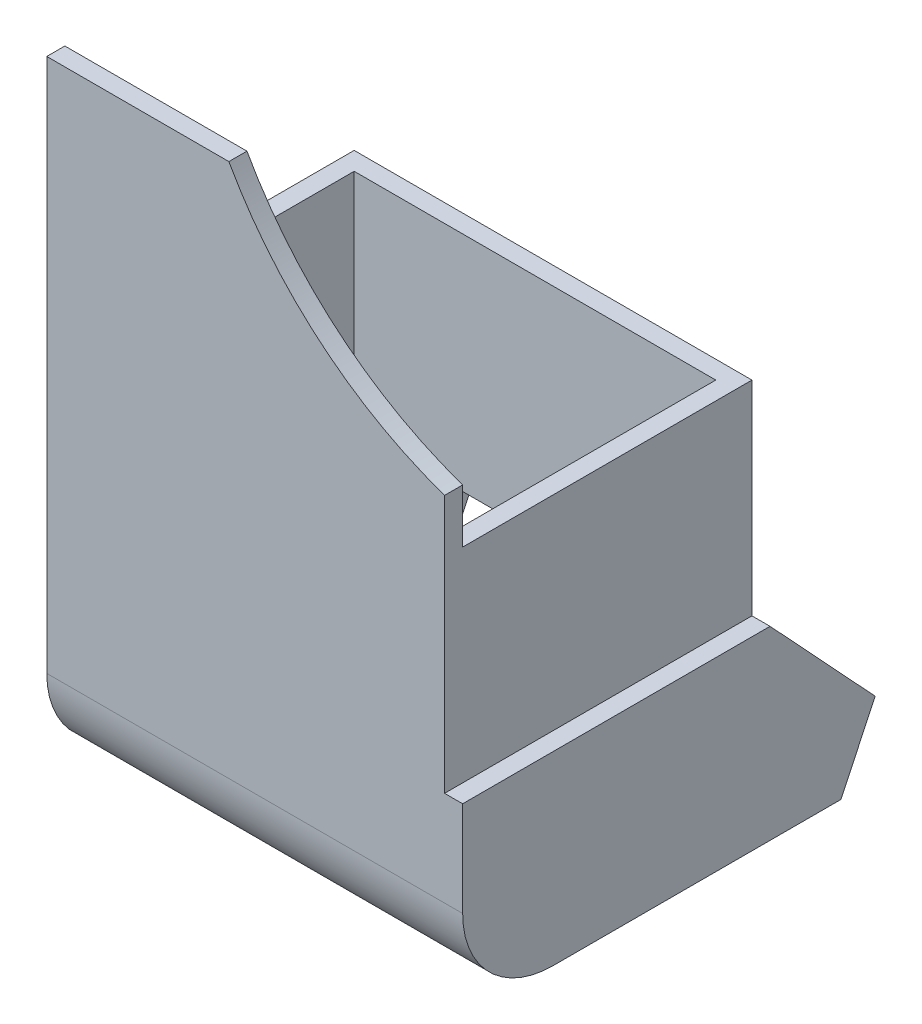
ISO-10303-21;
HEADER;
FILE_DESCRIPTION(('STEP AP214'),'2;1');
FILE_NAME('part.step','',(''),(''),'','','');
FILE_SCHEMA(('AUTOMOTIVE_DESIGN { 1 0 10303 214 1 1 1 1 }'));
ENDSEC;
DATA;
#1=APPLICATION_CONTEXT('core data for automotive mechanical design processes');
#2=APPLICATION_PROTOCOL_DEFINITION('international standard','automotive_design',2000,#1);
#3=PRODUCT_CONTEXT('',#1,'mechanical');
#4=PRODUCT('Part','Part','',(#3));
#5=PRODUCT_RELATED_PRODUCT_CATEGORY('part','',(#4));
#6=PRODUCT_DEFINITION_FORMATION('','',#4);
#7=PRODUCT_DEFINITION_CONTEXT('part definition',#1,'design');
#8=PRODUCT_DEFINITION('design','',#6,#7);
#9=PRODUCT_DEFINITION_SHAPE('','',#8);
#10=(LENGTH_UNIT() NAMED_UNIT(*) SI_UNIT(.MILLI.,.METRE.));
#11=(NAMED_UNIT(*) PLANE_ANGLE_UNIT() SI_UNIT($,.RADIAN.));
#12=(NAMED_UNIT(*) SI_UNIT($,.STERADIAN.) SOLID_ANGLE_UNIT());
#13=UNCERTAINTY_MEASURE_WITH_UNIT(LENGTH_MEASURE(1.E-05),#10,'distance_accuracy_value','');
#14=(GEOMETRIC_REPRESENTATION_CONTEXT(3) GLOBAL_UNCERTAINTY_ASSIGNED_CONTEXT((#13)) GLOBAL_UNIT_ASSIGNED_CONTEXT((#10,
#11,#12)) REPRESENTATION_CONTEXT('',''));
#15=CARTESIAN_POINT('',(0.,0.,0.));
#16=DIRECTION('',(0.,0.,1.));
#17=DIRECTION('',(1.,0.,0.));
#18=AXIS2_PLACEMENT_3D('',#15,#16,#17);
#19=CARTESIAN_POINT('',(0.,34.55,0.));
#20=DIRECTION('',(0.,-1.,0.));
#21=DIRECTION('',(0.,0.,-1.));
#22=AXIS2_PLACEMENT_3D('',#19,#20,#21);
#23=PLANE('',#22);
#24=DIRECTION('',(1.,0.,0.));
#25=VECTOR('',#24,1.);
#26=CARTESIAN_POINT('',(0.,34.55,0.));
#27=LINE('',#26,#25);
#28=CARTESIAN_POINT('',(0.,34.55,0.));
#29=VERTEX_POINT('',#28);
#30=CARTESIAN_POINT('',(10.0701247517087,34.55,0.));
#31=VERTEX_POINT('',#30);
#32=EDGE_CURVE('E207',#29,#31,#27,.T.);
#33=ORIENTED_EDGE('',*,*,#32,.T.);
#34=DIRECTION('',(0.,0.,1.));
#35=VECTOR('',#34,1.);
#36=CARTESIAN_POINT('',(10.0701247517087,34.55,-26.294));
#37=LINE('',#36,#35);
#38=CARTESIAN_POINT('',(10.0701247517087,34.55,-1.));
#39=VERTEX_POINT('',#38);
#40=EDGE_CURVE('E190',#39,#31,#37,.T.);
#41=ORIENTED_EDGE('',*,*,#40,.F.);
#42=DIRECTION('',(1.,0.,0.));
#43=VECTOR('',#42,1.);
#44=CARTESIAN_POINT('',(0.,34.55,-1.));
#45=LINE('',#44,#43);
#46=CARTESIAN_POINT('',(0.,34.55,-1.));
#47=VERTEX_POINT('',#46);
#48=EDGE_CURVE('E463',#47,#39,#45,.T.);
#49=ORIENTED_EDGE('',*,*,#48,.F.);
#50=DIRECTION('',(0.,0.,1.));
#51=VECTOR('',#50,1.);
#52=CARTESIAN_POINT('',(0.,34.55,0.));
#53=LINE('',#52,#51);
#54=EDGE_CURVE('E212',#47,#29,#53,.T.);
#55=ORIENTED_EDGE('',*,*,#54,.T.);
#56=EDGE_LOOP('',(#33,#41,#49,#55));
#57=FACE_BOUND('',#56,.T.);
#58=ADVANCED_FACE('F33',(#57),#23,.F.);
#59=CARTESIAN_POINT('',(0.,10.256,0.));
#60=DIRECTION('',(0.,-1.,0.));
#61=DIRECTION('',(0.,0.,-1.));
#62=AXIS2_PLACEMENT_3D('',#59,#60,#61);
#63=PLANE('',#62);
#64=DIRECTION('',(0.,0.,-1.));
#65=VECTOR('',#64,1.);
#66=CARTESIAN_POINT('',(22.,10.256,0.));
#67=LINE('',#66,#65);
#68=CARTESIAN_POINT('',(22.,10.256,0.));
#69=VERTEX_POINT('',#68);
#70=CARTESIAN_POINT('',(22.,10.256,-17.));
#71=VERTEX_POINT('',#70);
#72=EDGE_CURVE('E222',#69,#71,#67,.T.);
#73=ORIENTED_EDGE('',*,*,#72,.F.);
#74=DIRECTION('',(1.,0.,0.));
#75=VECTOR('',#74,1.);
#76=CARTESIAN_POINT('',(0.,10.256,0.));
#77=LINE('',#76,#75);
#78=CARTESIAN_POINT('',(23.,10.256,0.));
#79=VERTEX_POINT('',#78);
#80=EDGE_CURVE('E283',#69,#79,#77,.T.);
#81=ORIENTED_EDGE('',*,*,#80,.T.);
#82=DIRECTION('',(0.,0.,-1.));
#83=VECTOR('',#82,1.);
#84=CARTESIAN_POINT('',(23.,10.256,0.));
#85=LINE('',#84,#83);
#86=CARTESIAN_POINT('',(23.,10.256,-17.));
#87=VERTEX_POINT('',#86);
#88=EDGE_CURVE('E285',#79,#87,#85,.T.);
#89=ORIENTED_EDGE('',*,*,#88,.T.);
#90=DIRECTION('',(-1.,0.,0.));
#91=VECTOR('',#90,1.);
#92=CARTESIAN_POINT('',(0.,10.256,-17.));
#93=LINE('',#92,#91);
#94=EDGE_CURVE('E288',#87,#71,#93,.T.);
#95=ORIENTED_EDGE('',*,*,#94,.T.);
#96=EDGE_LOOP('',(#73,#81,#89,#95));
#97=FACE_BOUND('',#96,.T.);
#98=ADVANCED_FACE('F345',(#97),#63,.F.);
#99=CARTESIAN_POINT('',(0.,0.,-20.918));
#100=DIRECTION('',(0.,-0.42877746511979,-0.903410142407892));
#101=DIRECTION('',(0.,0.903410142407892,-0.42877746511979));
#102=AXIS2_PLACEMENT_3D('',#99,#100,#101);
#103=PLANE('',#102);
#104=DIRECTION('',(0.,0.903410142407892,-0.42877746511979));
#105=VECTOR('',#104,1.);
#106=CARTESIAN_POINT('',(23.,0.,-20.918));
#107=LINE('',#106,#105);
#108=CARTESIAN_POINT('',(23.,0.,-20.918));
#109=VERTEX_POINT('',#108);
#110=CARTESIAN_POINT('',(23.,4.00030011058215,-22.8166266155504));
#111=VERTEX_POINT('',#110);
#112=EDGE_CURVE('E238',#109,#111,#107,.T.);
#113=ORIENTED_EDGE('',*,*,#112,.F.);
#114=DIRECTION('',(1.,0.,0.));
#115=VECTOR('',#114,1.);
#116=CARTESIAN_POINT('',(0.,0.,-20.918));
#117=LINE('',#116,#115);
#118=CARTESIAN_POINT('',(0.,0.,-20.918));
#119=VERTEX_POINT('',#118);
#120=EDGE_CURVE('E273',#119,#109,#117,.T.);
#121=ORIENTED_EDGE('',*,*,#120,.F.);
#122=DIRECTION('',(0.,0.903410142407892,-0.42877746511979));
#123=VECTOR('',#122,1.);
#124=CARTESIAN_POINT('',(0.,0.,-20.918));
#125=LINE('',#124,#123);
#126=CARTESIAN_POINT('',(0.,4.00030011058215,-22.8166266155504));
#127=VERTEX_POINT('',#126);
#128=EDGE_CURVE('E266',#119,#127,#125,.T.);
#129=ORIENTED_EDGE('',*,*,#128,.T.);
#130=DIRECTION('',(1.,0.,0.));
#131=VECTOR('',#130,1.);
#132=CARTESIAN_POINT('',(0.,4.00030011058215,-22.8166266155504));
#133=LINE('',#132,#131);
#134=EDGE_CURVE('E278',#127,#111,#133,.T.);
#135=ORIENTED_EDGE('',*,*,#134,.T.);
#136=EDGE_LOOP('',(#113,#121,#129,#135));
#137=FACE_BOUND('',#136,.T.);
#138=DIRECTION('',(1.,0.,0.));
#139=VECTOR('',#138,1.);
#140=CARTESIAN_POINT('',(0.,1.044,-21.4135043701324));
#141=LINE('',#140,#139);
#142=CARTESIAN_POINT('',(1.044,1.044,-21.4135043701324));
#143=VERTEX_POINT('',#142);
#144=CARTESIAN_POINT('',(21.956,1.044,-21.4135043701324));
#145=VERTEX_POINT('',#144);
#146=EDGE_CURVE('E247',#143,#145,#141,.T.);
#147=ORIENTED_EDGE('',*,*,#146,.T.);
#148=DIRECTION('',(0.,0.903410142407892,-0.42877746511979));
#149=VECTOR('',#148,1.);
#150=CARTESIAN_POINT('',(21.956,0.,-20.918));
#151=LINE('',#150,#149);
#152=CARTESIAN_POINT('',(21.956,2.9852523174822,-22.3348635720885));
#153=VERTEX_POINT('',#152);
#154=EDGE_CURVE('E230',#145,#153,#151,.T.);
#155=ORIENTED_EDGE('',*,*,#154,.T.);
#156=DIRECTION('',(1.,0.,0.));
#157=VECTOR('',#156,1.);
#158=CARTESIAN_POINT('',(0.,2.9852523174822,-22.3348635720885));
#159=LINE('',#158,#157);
#160=CARTESIAN_POINT('',(1.044,2.9852523174822,-22.3348635720885));
#161=VERTEX_POINT('',#160);
#162=EDGE_CURVE('E235',#161,#153,#159,.T.);
#163=ORIENTED_EDGE('',*,*,#162,.F.);
#164=DIRECTION('',(0.,0.903410142407892,-0.42877746511979));
#165=VECTOR('',#164,1.);
#166=CARTESIAN_POINT('',(1.044,0.267596774077476,-21.045007060334));
#167=LINE('',#166,#165);
#168=EDGE_CURVE('E248',#143,#161,#167,.T.);
#169=ORIENTED_EDGE('',*,*,#168,.F.);
#170=EDGE_LOOP('',(#147,#155,#163,#169));
#171=FACE_BOUND('',#170,.T.);
#172=ADVANCED_FACE('F334',(#137,#171),#103,.T.);
#173=CARTESIAN_POINT('',(0.,10.256,0.));
#174=DIRECTION('',(1.,0.,0.));
#175=DIRECTION('',(0.,0.,-1.));
#176=AXIS2_PLACEMENT_3D('',#173,#174,#175);
#177=PLANE('',#176);
#178=DIRECTION('',(0.,0.,1.));
#179=VECTOR('',#178,1.);
#180=CARTESIAN_POINT('',(0.,0.,0.));
#181=LINE('',#180,#179);
#182=CARTESIAN_POINT('',(0.,0.,-5.));
#183=VERTEX_POINT('',#182);
#184=EDGE_CURVE('E280',#119,#183,#181,.T.);
#185=ORIENTED_EDGE('',*,*,#184,.T.);
#186=CARTESIAN_POINT('',(0.,5.,-5.));
#187=DIRECTION('',(1.,0.,0.));
#188=DIRECTION('',(0.,0.,-1.));
#189=AXIS2_PLACEMENT_3D('',#186,#187,#188);
#190=CIRCLE('',#189,5.);
#191=CARTESIAN_POINT('',(0.,5.,0.));
#192=VERTEX_POINT('',#191);
#193=EDGE_CURVE('E317',#183,#192,#190,.F.);
#194=ORIENTED_EDGE('',*,*,#193,.T.);
#195=DIRECTION('',(0.,-1.,0.));
#196=VECTOR('',#195,1.);
#197=CARTESIAN_POINT('',(0.,10.256,0.));
#198=LINE('',#197,#196);
#199=EDGE_CURVE('E297',#29,#192,#198,.T.);
#200=ORIENTED_EDGE('',*,*,#199,.F.);
#201=ORIENTED_EDGE('',*,*,#54,.F.);
#202=DIRECTION('',(0.,-1.,0.));
#203=VECTOR('',#202,1.);
#204=CARTESIAN_POINT('',(0.,10.256,-1.));
#205=LINE('',#204,#203);
#206=CARTESIAN_POINT('',(0.,21.55,-1.));
#207=VERTEX_POINT('',#206);
#208=EDGE_CURVE('E442',#47,#207,#205,.T.);
#209=ORIENTED_EDGE('',*,*,#208,.T.);
#210=DIRECTION('',(0.,0.,-1.));
#211=VECTOR('',#210,1.);
#212=CARTESIAN_POINT('',(0.,21.55,0.));
#213=LINE('',#212,#211);
#214=CARTESIAN_POINT('',(0.,21.55,-17.));
#215=VERTEX_POINT('',#214);
#216=EDGE_CURVE('E439',#207,#215,#213,.T.);
#217=ORIENTED_EDGE('',*,*,#216,.T.);
#218=DIRECTION('',(0.,-1.,0.));
#219=VECTOR('',#218,1.);
#220=CARTESIAN_POINT('',(0.,34.55,-17.));
#221=LINE('',#220,#219);
#222=CARTESIAN_POINT('',(0.,10.256,-17.));
#223=VERTEX_POINT('',#222);
#224=EDGE_CURVE('E214',#215,#223,#221,.T.);
#225=ORIENTED_EDGE('',*,*,#224,.T.);
#226=DIRECTION('',(0.,0.732340209043995,0.680938923999354));
#227=VECTOR('',#226,1.);
#228=CARTESIAN_POINT('',(0.,4.00030011058215,-22.8166266155504));
#229=LINE('',#228,#227);
#230=EDGE_CURVE('E269',#127,#223,#229,.T.);
#231=ORIENTED_EDGE('',*,*,#230,.F.);
#232=ORIENTED_EDGE('',*,*,#128,.F.);
#233=EDGE_LOOP('',(#185,#194,#200,#201,#209,#217,#225,#231,#232));
#234=FACE_BOUND('',#233,.T.);
#235=ADVANCED_FACE('F388',(#234),#177,.F.);
#236=CARTESIAN_POINT('',(0.,10.256,0.));
#237=DIRECTION('',(0.,0.,-1.));
#238=DIRECTION('',(-1.,0.,0.));
#239=AXIS2_PLACEMENT_3D('',#236,#237,#238);
#240=PLANE('',#239);
#241=ORIENTED_EDGE('',*,*,#199,.T.);
#242=DIRECTION('',(1.,0.,0.));
#243=VECTOR('',#242,1.);
#244=CARTESIAN_POINT('',(23.,5.,0.));
#245=LINE('',#244,#243);
#246=CARTESIAN_POINT('',(23.,5.,0.));
#247=VERTEX_POINT('',#246);
#248=EDGE_CURVE('E310',#192,#247,#245,.T.);
#249=ORIENTED_EDGE('',*,*,#248,.T.);
#250=DIRECTION('',(0.,-1.,0.));
#251=VECTOR('',#250,1.);
#252=CARTESIAN_POINT('',(23.,10.256,0.));
#253=LINE('',#252,#251);
#254=EDGE_CURVE('E291',#79,#247,#253,.T.);
#255=ORIENTED_EDGE('',*,*,#254,.F.);
#256=ORIENTED_EDGE('',*,*,#80,.F.);
#257=DIRECTION('',(0.,-1.,0.));
#258=VECTOR('',#257,1.);
#259=CARTESIAN_POINT('',(22.,34.55,0.));
#260=LINE('',#259,#258);
#261=CARTESIAN_POINT('',(22.,24.5273191003027,0.));
#262=VERTEX_POINT('',#261);
#263=EDGE_CURVE('E209',#262,#69,#260,.T.);
#264=ORIENTED_EDGE('',*,*,#263,.F.);
#265=CARTESIAN_POINT('',(29.1848877777159,45.1907368886367,0.));
#266=DIRECTION('',(0.,0.,1.));
#267=DIRECTION('',(1.,0.,0.));
#268=AXIS2_PLACEMENT_3D('',#265,#266,#267);
#269=CIRCLE('',#268,21.8769158492144);
#270=EDGE_CURVE('E193',#31,#262,#269,.T.);
#271=ORIENTED_EDGE('',*,*,#270,.F.);
#272=ORIENTED_EDGE('',*,*,#32,.F.);
#273=EDGE_LOOP('',(#241,#249,#255,#256,#264,#271,#272));
#274=FACE_BOUND('',#273,.T.);
#275=ADVANCED_FACE('F206',(#274),#240,.F.);
#276=CARTESIAN_POINT('',(23.,10.256,0.));
#277=DIRECTION('',(-1.,0.,0.));
#278=DIRECTION('',(0.,0.,1.));
#279=AXIS2_PLACEMENT_3D('',#276,#277,#278);
#280=PLANE('',#279);
#281=ORIENTED_EDGE('',*,*,#254,.T.);
#282=CARTESIAN_POINT('',(23.,5.,-5.));
#283=DIRECTION('',(-1.,0.,0.));
#284=DIRECTION('',(0.,0.,1.));
#285=AXIS2_PLACEMENT_3D('',#282,#283,#284);
#286=CIRCLE('',#285,5.);
#287=CARTESIAN_POINT('',(23.,0.,-5.));
#288=VERTEX_POINT('',#287);
#289=EDGE_CURVE('E313',#247,#288,#286,.F.);
#290=ORIENTED_EDGE('',*,*,#289,.T.);
#291=DIRECTION('',(0.,0.,-1.));
#292=VECTOR('',#291,1.);
#293=CARTESIAN_POINT('',(23.,0.,0.));
#294=LINE('',#293,#292);
#295=EDGE_CURVE('E286',#288,#109,#294,.T.);
#296=ORIENTED_EDGE('',*,*,#295,.T.);
#297=ORIENTED_EDGE('',*,*,#112,.T.);
#298=DIRECTION('',(0.,0.732340209043995,0.680938923999354));
#299=VECTOR('',#298,1.);
#300=CARTESIAN_POINT('',(23.,4.00030011058215,-22.8166266155504));
#301=LINE('',#300,#299);
#302=EDGE_CURVE('E270',#111,#87,#301,.T.);
#303=ORIENTED_EDGE('',*,*,#302,.T.);
#304=ORIENTED_EDGE('',*,*,#88,.F.);
#305=EDGE_LOOP('',(#281,#290,#296,#297,#303,#304));
#306=FACE_BOUND('',#305,.T.);
#307=ADVANCED_FACE('F393',(#306),#280,.F.);
#308=CARTESIAN_POINT('',(0.,0.,0.));
#309=DIRECTION('',(0.,-1.,0.));
#310=DIRECTION('',(0.,0.,-1.));
#311=AXIS2_PLACEMENT_3D('',#308,#309,#310);
#312=PLANE('',#311);
#313=ORIENTED_EDGE('',*,*,#295,.F.);
#314=DIRECTION('',(1.,0.,0.));
#315=VECTOR('',#314,1.);
#316=CARTESIAN_POINT('',(0.,0.,-5.));
#317=LINE('',#316,#315);
#318=EDGE_CURVE('E315',#288,#183,#317,.F.);
#319=ORIENTED_EDGE('',*,*,#318,.T.);
#320=ORIENTED_EDGE('',*,*,#184,.F.);
#321=ORIENTED_EDGE('',*,*,#120,.T.);
#322=EDGE_LOOP('',(#313,#319,#320,#321));
#323=FACE_BOUND('',#322,.T.);
#324=ADVANCED_FACE('F385',(#323),#312,.T.);
#325=CARTESIAN_POINT('',(0.,4.00030011058215,-22.8166266155504));
#326=DIRECTION('',(0.,0.680938923999354,-0.732340209043995));
#327=DIRECTION('',(0.,0.732340209043995,0.680938923999354));
#328=AXIS2_PLACEMENT_3D('',#325,#326,#327);
#329=PLANE('',#328);
#330=ORIENTED_EDGE('',*,*,#302,.F.);
#331=ORIENTED_EDGE('',*,*,#134,.F.);
#332=ORIENTED_EDGE('',*,*,#230,.T.);
#333=DIRECTION('',(-1.,0.,0.));
#334=VECTOR('',#333,1.);
#335=CARTESIAN_POINT('',(0.,10.256,-17.));
#336=LINE('',#335,#334);
#337=EDGE_CURVE('E218',#71,#223,#336,.T.);
#338=ORIENTED_EDGE('',*,*,#337,.F.);
#339=ORIENTED_EDGE('',*,*,#94,.F.);
#340=EDGE_LOOP('',(#330,#331,#332,#338,#339));
#341=FACE_BOUND('',#340,.T.);
#342=ADVANCED_FACE('F369',(#341),#329,.T.);
#343=CARTESIAN_POINT('',(1.044,10.256,0.));
#344=DIRECTION('',(1.,0.,0.));
#345=DIRECTION('',(0.,0.,-1.));
#346=AXIS2_PLACEMENT_3D('',#343,#344,#345);
#347=PLANE('',#346);
#348=DIRECTION('',(0.,-1.,0.));
#349=VECTOR('',#348,1.);
#350=CARTESIAN_POINT('',(1.044,10.256,-1.044));
#351=LINE('',#350,#349);
#352=CARTESIAN_POINT('',(1.044,6.918,-1.044));
#353=VERTEX_POINT('',#352);
#354=CARTESIAN_POINT('',(1.044,6.044,-1.044));
#355=VERTEX_POINT('',#354);
#356=EDGE_CURVE('E236',#353,#355,#351,.T.);
#357=ORIENTED_EDGE('',*,*,#356,.T.);
#358=CARTESIAN_POINT('',(1.044,6.044,-6.044));
#359=DIRECTION('',(1.,0.,0.));
#360=DIRECTION('',(0.,0.,-1.));
#361=AXIS2_PLACEMENT_3D('',#358,#359,#360);
#362=CIRCLE('',#361,5.);
#363=CARTESIAN_POINT('',(1.044,1.044,-6.044));
#364=VERTEX_POINT('',#363);
#365=EDGE_CURVE('E11',#355,#364,#362,.T.);
#366=ORIENTED_EDGE('',*,*,#365,.T.);
#367=DIRECTION('',(0.,0.,1.));
#368=VECTOR('',#367,1.);
#369=CARTESIAN_POINT('',(1.044,1.044,0.));
#370=LINE('',#369,#368);
#371=EDGE_CURVE('E231',#143,#364,#370,.T.);
#372=ORIENTED_EDGE('',*,*,#371,.F.);
#373=ORIENTED_EDGE('',*,*,#168,.T.);
#374=DIRECTION('',(0.,0.732340209043995,0.680938923999354));
#375=VECTOR('',#374,1.);
#376=CARTESIAN_POINT('',(1.044,18.0226419804586,-8.35291391206231));
#377=LINE('',#376,#375);
#378=CARTESIAN_POINT('',(1.044,9.212,-16.5451570742244));
#379=VERTEX_POINT('',#378);
#380=EDGE_CURVE('E244',#161,#379,#377,.T.);
#381=ORIENTED_EDGE('',*,*,#380,.T.);
#382=DIRECTION('',(0.,0.,1.));
#383=VECTOR('',#382,1.);
#384=CARTESIAN_POINT('',(1.044,9.212,0.));
#385=LINE('',#384,#383);
#386=CARTESIAN_POINT('',(1.044,9.212,-16.));
#387=VERTEX_POINT('',#386);
#388=EDGE_CURVE('E240',#379,#387,#385,.T.);
#389=ORIENTED_EDGE('',*,*,#388,.T.);
#390=DIRECTION('',(0.,1.,0.));
#391=VECTOR('',#390,1.);
#392=CARTESIAN_POINT('',(1.044,10.256,-16.));
#393=LINE('',#392,#391);
#394=CARTESIAN_POINT('',(1.044,6.918,-16.));
#395=VERTEX_POINT('',#394);
#396=EDGE_CURVE('E459',#395,#387,#393,.T.);
#397=ORIENTED_EDGE('',*,*,#396,.F.);
#398=DIRECTION('',(0.,0.,1.));
#399=VECTOR('',#398,1.);
#400=CARTESIAN_POINT('',(1.044,6.918,0.));
#401=LINE('',#400,#399);
#402=EDGE_CURVE('E461',#395,#353,#401,.T.);
#403=ORIENTED_EDGE('',*,*,#402,.T.);
#404=EDGE_LOOP('',(#357,#366,#372,#373,#381,#389,#397,#403));
#405=FACE_BOUND('',#404,.T.);
#406=ADVANCED_FACE('F336',(#405),#347,.T.);
#407=CARTESIAN_POINT('',(0.,10.256,-1.044));
#408=DIRECTION('',(0.,0.,-1.));
#409=DIRECTION('',(-1.,0.,0.));
#410=AXIS2_PLACEMENT_3D('',#407,#408,#409);
#411=PLANE('',#410);
#412=DIRECTION('',(0.,-1.,0.));
#413=VECTOR('',#412,1.);
#414=CARTESIAN_POINT('',(21.956,10.256,-1.044));
#415=LINE('',#414,#413);
#416=CARTESIAN_POINT('',(21.956,9.212,-1.044));
#417=VERTEX_POINT('',#416);
#418=CARTESIAN_POINT('',(21.956,6.044,-1.044));
#419=VERTEX_POINT('',#418);
#420=EDGE_CURVE('E239',#417,#419,#415,.T.);
#421=ORIENTED_EDGE('',*,*,#420,.T.);
#422=DIRECTION('',(1.,0.,0.));
#423=VECTOR('',#422,1.);
#424=CARTESIAN_POINT('',(0.,6.044,-1.044));
#425=LINE('',#424,#423);
#426=EDGE_CURVE('E41',#419,#355,#425,.F.);
#427=ORIENTED_EDGE('',*,*,#426,.T.);
#428=ORIENTED_EDGE('',*,*,#356,.F.);
#429=DIRECTION('',(1.,0.,0.));
#430=VECTOR('',#429,1.);
#431=CARTESIAN_POINT('',(0.,6.918,-1.044));
#432=LINE('',#431,#430);
#433=CARTESIAN_POINT('',(21.,6.918,-1.044));
#434=VERTEX_POINT('',#433);
#435=EDGE_CURVE('E304',#353,#434,#432,.T.);
#436=ORIENTED_EDGE('',*,*,#435,.T.);
#437=DIRECTION('',(0.,-1.,0.));
#438=VECTOR('',#437,1.);
#439=CARTESIAN_POINT('',(21.,10.256,-1.044));
#440=LINE('',#439,#438);
#441=CARTESIAN_POINT('',(21.,9.212,-1.044));
#442=VERTEX_POINT('',#441);
#443=EDGE_CURVE('E457',#442,#434,#440,.T.);
#444=ORIENTED_EDGE('',*,*,#443,.F.);
#445=DIRECTION('',(1.,0.,0.));
#446=VECTOR('',#445,1.);
#447=CARTESIAN_POINT('',(0.,9.212,-1.044));
#448=LINE('',#447,#446);
#449=EDGE_CURVE('E243',#442,#417,#448,.T.);
#450=ORIENTED_EDGE('',*,*,#449,.T.);
#451=EDGE_LOOP('',(#421,#427,#428,#436,#444,#450));
#452=FACE_BOUND('',#451,.T.);
#453=ADVANCED_FACE('F368',(#452),#411,.T.);
#454=CARTESIAN_POINT('',(21.956,10.256,0.));
#455=DIRECTION('',(-1.,0.,0.));
#456=DIRECTION('',(0.,0.,1.));
#457=AXIS2_PLACEMENT_3D('',#454,#455,#456);
#458=PLANE('',#457);
#459=DIRECTION('',(0.,0.,-1.));
#460=VECTOR('',#459,1.);
#461=CARTESIAN_POINT('',(21.956,1.044,0.));
#462=LINE('',#461,#460);
#463=CARTESIAN_POINT('',(21.956,1.044,-6.044));
#464=VERTEX_POINT('',#463);
#465=EDGE_CURVE('E234',#464,#145,#462,.T.);
#466=ORIENTED_EDGE('',*,*,#465,.F.);
#467=CARTESIAN_POINT('',(21.956,6.044,-6.044));
#468=DIRECTION('',(-1.,0.,0.));
#469=DIRECTION('',(0.,0.,1.));
#470=AXIS2_PLACEMENT_3D('',#467,#468,#469);
#471=CIRCLE('',#470,5.);
#472=EDGE_CURVE('E55',#464,#419,#471,.T.);
#473=ORIENTED_EDGE('',*,*,#472,.T.);
#474=ORIENTED_EDGE('',*,*,#420,.F.);
#475=DIRECTION('',(0.,0.,-1.));
#476=VECTOR('',#475,1.);
#477=CARTESIAN_POINT('',(21.956,9.212,0.));
#478=LINE('',#477,#476);
#479=CARTESIAN_POINT('',(21.956,9.212,-16.5451570742244));
#480=VERTEX_POINT('',#479);
#481=EDGE_CURVE('E252',#417,#480,#478,.T.);
#482=ORIENTED_EDGE('',*,*,#481,.T.);
#483=DIRECTION('',(0.,0.732340209043995,0.680938923999354));
#484=VECTOR('',#483,1.);
#485=CARTESIAN_POINT('',(21.956,3.28939987392682,-22.0520634373085));
#486=LINE('',#485,#484);
#487=EDGE_CURVE('E254',#153,#480,#486,.T.);
#488=ORIENTED_EDGE('',*,*,#487,.F.);
#489=ORIENTED_EDGE('',*,*,#154,.F.);
#490=EDGE_LOOP('',(#466,#473,#474,#482,#488,#489));
#491=FACE_BOUND('',#490,.T.);
#492=ADVANCED_FACE('F329',(#491),#458,.T.);
#493=CARTESIAN_POINT('',(0.,9.212,0.));
#494=DIRECTION('',(0.,-1.,0.));
#495=DIRECTION('',(0.,0.,-1.));
#496=AXIS2_PLACEMENT_3D('',#493,#494,#495);
#497=PLANE('',#496);
#498=DIRECTION('',(1.,0.,0.));
#499=VECTOR('',#498,1.);
#500=CARTESIAN_POINT('',(0.,9.212,-16.));
#501=LINE('',#500,#499);
#502=CARTESIAN_POINT('',(21.,9.212,-16.));
#503=VERTEX_POINT('',#502);
#504=EDGE_CURVE('E301',#387,#503,#501,.T.);
#505=ORIENTED_EDGE('',*,*,#504,.F.);
#506=ORIENTED_EDGE('',*,*,#388,.F.);
#507=DIRECTION('',(-1.,0.,0.));
#508=VECTOR('',#507,1.);
#509=CARTESIAN_POINT('',(0.,9.212,-16.5451570742244));
#510=LINE('',#509,#508);
#511=EDGE_CURVE('E250',#480,#379,#510,.T.);
#512=ORIENTED_EDGE('',*,*,#511,.F.);
#513=ORIENTED_EDGE('',*,*,#481,.F.);
#514=ORIENTED_EDGE('',*,*,#449,.F.);
#515=DIRECTION('',(0.,0.,1.));
#516=VECTOR('',#515,1.);
#517=CARTESIAN_POINT('',(21.,9.212,0.));
#518=LINE('',#517,#516);
#519=EDGE_CURVE('E299',#503,#442,#518,.T.);
#520=ORIENTED_EDGE('',*,*,#519,.F.);
#521=EDGE_LOOP('',(#505,#506,#512,#513,#514,#520));
#522=FACE_BOUND('',#521,.T.);
#523=ADVANCED_FACE('F374',(#522),#497,.T.);
#524=CARTESIAN_POINT('',(0.,1.044,0.));
#525=DIRECTION('',(0.,-1.,0.));
#526=DIRECTION('',(0.,0.,-1.));
#527=AXIS2_PLACEMENT_3D('',#524,#525,#526);
#528=PLANE('',#527);
#529=ORIENTED_EDGE('',*,*,#371,.T.);
#530=DIRECTION('',(1.,0.,0.));
#531=VECTOR('',#530,1.);
#532=CARTESIAN_POINT('',(0.,1.044,-6.044));
#533=LINE('',#532,#531);
#534=EDGE_CURVE('E319',#364,#464,#533,.T.);
#535=ORIENTED_EDGE('',*,*,#534,.T.);
#536=ORIENTED_EDGE('',*,*,#465,.T.);
#537=ORIENTED_EDGE('',*,*,#146,.F.);
#538=EDGE_LOOP('',(#529,#535,#536,#537));
#539=FACE_BOUND('',#538,.T.);
#540=ADVANCED_FACE('F324',(#539),#528,.F.);
#541=CARTESIAN_POINT('',(0.,3.28939987392682,-22.0520634373085));
#542=DIRECTION('',(0.,0.680938923999354,-0.732340209043995));
#543=DIRECTION('',(0.,0.732340209043995,0.680938923999354));
#544=AXIS2_PLACEMENT_3D('',#541,#542,#543);
#545=PLANE('',#544);
#546=ORIENTED_EDGE('',*,*,#487,.T.);
#547=ORIENTED_EDGE('',*,*,#511,.T.);
#548=ORIENTED_EDGE('',*,*,#380,.F.);
#549=ORIENTED_EDGE('',*,*,#162,.T.);
#550=EDGE_LOOP('',(#546,#547,#548,#549));
#551=FACE_BOUND('',#550,.T.);
#552=ADVANCED_FACE('F364',(#551),#545,.F.);
#553=CARTESIAN_POINT('',(22.,34.55,0.));
#554=DIRECTION('',(-1.,0.,0.));
#555=DIRECTION('',(0.,0.,1.));
#556=AXIS2_PLACEMENT_3D('',#553,#554,#555);
#557=PLANE('',#556);
#558=DIRECTION('',(0.,-1.,0.));
#559=VECTOR('',#558,1.);
#560=CARTESIAN_POINT('',(22.,34.55,-1.));
#561=LINE('',#560,#559);
#562=CARTESIAN_POINT('',(22.,24.5273191003027,-1.));
#563=VERTEX_POINT('',#562);
#564=CARTESIAN_POINT('',(22.,21.55,-1.));
#565=VERTEX_POINT('',#564);
#566=EDGE_CURVE('E422',#563,#565,#561,.T.);
#567=ORIENTED_EDGE('',*,*,#566,.F.);
#568=DIRECTION('',(0.,0.,1.));
#569=VECTOR('',#568,1.);
#570=CARTESIAN_POINT('',(22.,24.5273191003027,-26.294));
#571=LINE('',#570,#569);
#572=EDGE_CURVE('E200',#563,#262,#571,.T.);
#573=ORIENTED_EDGE('',*,*,#572,.T.);
#574=ORIENTED_EDGE('',*,*,#263,.T.);
#575=ORIENTED_EDGE('',*,*,#72,.T.);
#576=DIRECTION('',(0.,-1.,0.));
#577=VECTOR('',#576,1.);
#578=CARTESIAN_POINT('',(22.,34.55,-17.));
#579=LINE('',#578,#577);
#580=CARTESIAN_POINT('',(22.,21.55,-17.));
#581=VERTEX_POINT('',#580);
#582=EDGE_CURVE('E216',#581,#71,#579,.T.);
#583=ORIENTED_EDGE('',*,*,#582,.F.);
#584=DIRECTION('',(0.,0.,-1.));
#585=VECTOR('',#584,1.);
#586=CARTESIAN_POINT('',(22.,21.55,-1.));
#587=LINE('',#586,#585);
#588=EDGE_CURVE('E424',#565,#581,#587,.T.);
#589=ORIENTED_EDGE('',*,*,#588,.F.);
#590=EDGE_LOOP('',(#567,#573,#574,#575,#583,#589));
#591=FACE_BOUND('',#590,.T.);
#592=ADVANCED_FACE('F360',(#591),#557,.F.);
#593=CARTESIAN_POINT('',(0.,34.55,-17.));
#594=DIRECTION('',(0.,0.,1.));
#595=DIRECTION('',(1.,0.,0.));
#596=AXIS2_PLACEMENT_3D('',#593,#594,#595);
#597=PLANE('',#596);
#598=ORIENTED_EDGE('',*,*,#224,.F.);
#599=DIRECTION('',(1.,0.,0.));
#600=VECTOR('',#599,1.);
#601=CARTESIAN_POINT('',(-4.29399999999999,21.55,-17.));
#602=LINE('',#601,#600);
#603=EDGE_CURVE('E429',#215,#581,#602,.T.);
#604=ORIENTED_EDGE('',*,*,#603,.T.);
#605=ORIENTED_EDGE('',*,*,#582,.T.);
#606=ORIENTED_EDGE('',*,*,#337,.T.);
#607=EDGE_LOOP('',(#598,#604,#605,#606));
#608=FACE_BOUND('',#607,.T.);
#609=ADVANCED_FACE('F356',(#608),#597,.F.);
#610=CARTESIAN_POINT('',(1.,10.256,0.));
#611=DIRECTION('',(1.,0.,0.));
#612=DIRECTION('',(0.,0.,-1.));
#613=AXIS2_PLACEMENT_3D('',#610,#611,#612);
#614=PLANE('',#613);
#615=DIRECTION('',(0.,0.,-1.));
#616=VECTOR('',#615,1.);
#617=CARTESIAN_POINT('',(1.,21.55,0.));
#618=LINE('',#617,#616);
#619=CARTESIAN_POINT('',(1.,21.55,-1.));
#620=VERTEX_POINT('',#619);
#621=CARTESIAN_POINT('',(1.,21.55,-16.));
#622=VERTEX_POINT('',#621);
#623=EDGE_CURVE('E437',#620,#622,#618,.T.);
#624=ORIENTED_EDGE('',*,*,#623,.F.);
#625=DIRECTION('',(0.,-1.,0.));
#626=VECTOR('',#625,1.);
#627=CARTESIAN_POINT('',(1.,10.256,-1.));
#628=LINE('',#627,#626);
#629=CARTESIAN_POINT('',(1.,6.918,-1.));
#630=VERTEX_POINT('',#629);
#631=EDGE_CURVE('E225',#620,#630,#628,.T.);
#632=ORIENTED_EDGE('',*,*,#631,.T.);
#633=DIRECTION('',(0.,0.,1.));
#634=VECTOR('',#633,1.);
#635=CARTESIAN_POINT('',(1.,6.918,-16.));
#636=LINE('',#635,#634);
#637=CARTESIAN_POINT('',(1.,6.918,-16.));
#638=VERTEX_POINT('',#637);
#639=EDGE_CURVE('E454',#638,#630,#636,.T.);
#640=ORIENTED_EDGE('',*,*,#639,.F.);
#641=DIRECTION('',(0.,-1.,0.));
#642=VECTOR('',#641,1.);
#643=CARTESIAN_POINT('',(1.,10.256,-16.));
#644=LINE('',#643,#642);
#645=EDGE_CURVE('E468',#622,#638,#644,.T.);
#646=ORIENTED_EDGE('',*,*,#645,.F.);
#647=EDGE_LOOP('',(#624,#632,#640,#646));
#648=FACE_BOUND('',#647,.T.);
#649=ADVANCED_FACE('F359',(#648),#614,.T.);
#650=CARTESIAN_POINT('',(0.,10.256,-1.));
#651=DIRECTION('',(0.,0.,-1.));
#652=DIRECTION('',(-1.,0.,0.));
#653=AXIS2_PLACEMENT_3D('',#650,#651,#652);
#654=PLANE('',#653);
#655=CARTESIAN_POINT('',(29.1848877777159,45.1907368886367,-1.));
#656=DIRECTION('',(0.,0.,-1.));
#657=DIRECTION('',(-1.,0.,0.));
#658=AXIS2_PLACEMENT_3D('',#655,#656,#657);
#659=CIRCLE('',#658,21.8769158492144);
#660=EDGE_CURVE('E196',#563,#39,#659,.T.);
#661=ORIENTED_EDGE('',*,*,#660,.F.);
#662=ORIENTED_EDGE('',*,*,#566,.T.);
#663=DIRECTION('',(1.,0.,0.));
#664=VECTOR('',#663,1.);
#665=CARTESIAN_POINT('',(-4.29399999999999,21.55,-1.));
#666=LINE('',#665,#664);
#667=CARTESIAN_POINT('',(21.,21.55,-1.));
#668=VERTEX_POINT('',#667);
#669=EDGE_CURVE('E428',#668,#565,#666,.T.);
#670=ORIENTED_EDGE('',*,*,#669,.F.);
#671=DIRECTION('',(0.,-1.,0.));
#672=VECTOR('',#671,1.);
#673=CARTESIAN_POINT('',(21.,34.55,-1.));
#674=LINE('',#673,#672);
#675=CARTESIAN_POINT('',(21.,6.918,-1.));
#676=VERTEX_POINT('',#675);
#677=EDGE_CURVE('E464',#668,#676,#674,.T.);
#678=ORIENTED_EDGE('',*,*,#677,.T.);
#679=DIRECTION('',(1.,0.,0.));
#680=VECTOR('',#679,1.);
#681=CARTESIAN_POINT('',(1.,6.918,-1.));
#682=LINE('',#681,#680);
#683=EDGE_CURVE('E445',#630,#676,#682,.T.);
#684=ORIENTED_EDGE('',*,*,#683,.F.);
#685=ORIENTED_EDGE('',*,*,#631,.F.);
#686=EDGE_CURVE('E433',#207,#620,#666,.T.);
#687=ORIENTED_EDGE('',*,*,#686,.F.);
#688=ORIENTED_EDGE('',*,*,#208,.F.);
#689=ORIENTED_EDGE('',*,*,#48,.T.);
#690=EDGE_LOOP('',(#661,#662,#670,#678,#684,#685,#687,#688,#689));
#691=FACE_BOUND('',#690,.T.);
#692=ADVANCED_FACE('F472',(#691),#654,.T.);
#693=CARTESIAN_POINT('',(21.,34.55,0.));
#694=DIRECTION('',(-1.,0.,0.));
#695=DIRECTION('',(0.,0.,1.));
#696=AXIS2_PLACEMENT_3D('',#693,#694,#695);
#697=PLANE('',#696);
#698=DIRECTION('',(0.,0.,1.));
#699=VECTOR('',#698,1.);
#700=CARTESIAN_POINT('',(21.,21.55,0.));
#701=LINE('',#700,#699);
#702=CARTESIAN_POINT('',(21.,21.55,-16.));
#703=VERTEX_POINT('',#702);
#704=EDGE_CURVE('E432',#703,#668,#701,.T.);
#705=ORIENTED_EDGE('',*,*,#704,.F.);
#706=DIRECTION('',(0.,-1.,0.));
#707=VECTOR('',#706,1.);
#708=CARTESIAN_POINT('',(21.,34.55,-16.));
#709=LINE('',#708,#707);
#710=EDGE_CURVE('E466',#703,#503,#709,.T.);
#711=ORIENTED_EDGE('',*,*,#710,.T.);
#712=ORIENTED_EDGE('',*,*,#519,.T.);
#713=ORIENTED_EDGE('',*,*,#443,.T.);
#714=DIRECTION('',(0.,0.,-1.));
#715=VECTOR('',#714,1.);
#716=CARTESIAN_POINT('',(21.,6.918,-1.));
#717=LINE('',#716,#715);
#718=EDGE_CURVE('E448',#676,#434,#717,.T.);
#719=ORIENTED_EDGE('',*,*,#718,.F.);
#720=ORIENTED_EDGE('',*,*,#677,.F.);
#721=EDGE_LOOP('',(#705,#711,#712,#713,#719,#720));
#722=FACE_BOUND('',#721,.T.);
#723=ADVANCED_FACE('F483',(#722),#697,.T.);
#724=CARTESIAN_POINT('',(0.,34.55,-16.));
#725=DIRECTION('',(0.,0.,1.));
#726=DIRECTION('',(1.,0.,0.));
#727=AXIS2_PLACEMENT_3D('',#724,#725,#726);
#728=PLANE('',#727);
#729=DIRECTION('',(1.,0.,0.));
#730=VECTOR('',#729,1.);
#731=CARTESIAN_POINT('',(0.,21.55,-16.));
#732=LINE('',#731,#730);
#733=EDGE_CURVE('E307',#622,#703,#732,.T.);
#734=ORIENTED_EDGE('',*,*,#733,.F.);
#735=ORIENTED_EDGE('',*,*,#645,.T.);
#736=DIRECTION('',(-1.,0.,0.));
#737=VECTOR('',#736,1.);
#738=CARTESIAN_POINT('',(21.,6.918,-16.));
#739=LINE('',#738,#737);
#740=EDGE_CURVE('E451',#395,#638,#739,.T.);
#741=ORIENTED_EDGE('',*,*,#740,.F.);
#742=ORIENTED_EDGE('',*,*,#396,.T.);
#743=ORIENTED_EDGE('',*,*,#504,.T.);
#744=ORIENTED_EDGE('',*,*,#710,.F.);
#745=EDGE_LOOP('',(#734,#735,#741,#742,#743,#744));
#746=FACE_BOUND('',#745,.T.);
#747=ADVANCED_FACE('F354',(#746),#728,.T.);
#748=CARTESIAN_POINT('',(0.,6.918,0.));
#749=DIRECTION('',(0.,1.,0.));
#750=DIRECTION('',(0.,0.,1.));
#751=AXIS2_PLACEMENT_3D('',#748,#749,#750);
#752=PLANE('',#751);
#753=ORIENTED_EDGE('',*,*,#740,.T.);
#754=ORIENTED_EDGE('',*,*,#639,.T.);
#755=ORIENTED_EDGE('',*,*,#683,.T.);
#756=ORIENTED_EDGE('',*,*,#718,.T.);
#757=ORIENTED_EDGE('',*,*,#435,.F.);
#758=ORIENTED_EDGE('',*,*,#402,.F.);
#759=EDGE_LOOP('',(#753,#754,#755,#756,#757,#758));
#760=FACE_BOUND('',#759,.T.);
#761=ADVANCED_FACE('F487',(#760),#752,.T.);
#762=CARTESIAN_POINT('',(-4.29399999999999,21.55,-1.));
#763=DIRECTION('',(0.,-1.,0.));
#764=DIRECTION('',(0.,0.,-1.));
#765=AXIS2_PLACEMENT_3D('',#762,#763,#764);
#766=PLANE('',#765);
#767=ORIENTED_EDGE('',*,*,#686,.T.);
#768=ORIENTED_EDGE('',*,*,#623,.T.);
#769=ORIENTED_EDGE('',*,*,#733,.T.);
#770=ORIENTED_EDGE('',*,*,#704,.T.);
#771=ORIENTED_EDGE('',*,*,#669,.T.);
#772=ORIENTED_EDGE('',*,*,#588,.T.);
#773=ORIENTED_EDGE('',*,*,#603,.F.);
#774=ORIENTED_EDGE('',*,*,#216,.F.);
#775=EDGE_LOOP('',(#767,#768,#769,#770,#771,#772,#773,#774));
#776=FACE_BOUND('',#775,.T.);
#777=ADVANCED_FACE('F476',(#776),#766,.F.);
#778=CARTESIAN_POINT('',(29.1848877777159,45.1907368886367,-26.294));
#779=DIRECTION('',(0.,0.,1.));
#780=DIRECTION('',(1.,0.,0.));
#781=AXIS2_PLACEMENT_3D('',#778,#779,#780);
#782=CYLINDRICAL_SURFACE('',#781,21.8769158492144);
#783=ORIENTED_EDGE('',*,*,#660,.T.);
#784=ORIENTED_EDGE('',*,*,#40,.T.);
#785=ORIENTED_EDGE('',*,*,#270,.T.);
#786=ORIENTED_EDGE('',*,*,#572,.F.);
#787=EDGE_LOOP('',(#783,#784,#785,#786));
#788=FACE_BOUND('',#787,.T.);
#789=ADVANCED_FACE('F192',(#788),#782,.F.);
#790=CARTESIAN_POINT('',(0.,5.,-5.));
#791=DIRECTION('',(-1.,0.,0.));
#792=DIRECTION('',(0.,0.,1.));
#793=AXIS2_PLACEMENT_3D('',#790,#791,#792);
#794=CYLINDRICAL_SURFACE('',#793,5.);
#795=ORIENTED_EDGE('',*,*,#193,.F.);
#796=ORIENTED_EDGE('',*,*,#318,.F.);
#797=ORIENTED_EDGE('',*,*,#289,.F.);
#798=ORIENTED_EDGE('',*,*,#248,.F.);
#799=EDGE_LOOP('',(#795,#796,#797,#798));
#800=FACE_BOUND('',#799,.T.);
#801=ADVANCED_FACE('F339',(#800),#794,.T.);
#802=CARTESIAN_POINT('',(0.,6.044,-6.044));
#803=DIRECTION('',(1.,0.,0.));
#804=DIRECTION('',(0.,0.,-1.));
#805=AXIS2_PLACEMENT_3D('',#802,#803,#804);
#806=CYLINDRICAL_SURFACE('',#805,5.);
#807=ORIENTED_EDGE('',*,*,#365,.F.);
#808=ORIENTED_EDGE('',*,*,#426,.F.);
#809=ORIENTED_EDGE('',*,*,#472,.F.);
#810=ORIENTED_EDGE('',*,*,#534,.F.);
#811=EDGE_LOOP('',(#807,#808,#809,#810));
#812=FACE_BOUND('',#811,.T.);
#813=ADVANCED_FACE('F35',(#812),#806,.F.);
#814=CLOSED_SHELL('',(#58,#98,#172,#235,#275,#307,#324,#342,#406,#453,#492,#523,#540,#552,#592,
#609,#649,#692,#723,#747,#761,#777,#789,#801,#813));
#815=MANIFOLD_SOLID_BREP('B2',#814);
#816=ADVANCED_BREP_SHAPE_REPRESENTATION('',(#18,#815),#14);
#817=SHAPE_DEFINITION_REPRESENTATION(#9,#816);
ENDSEC;
END-ISO-10303-21;
